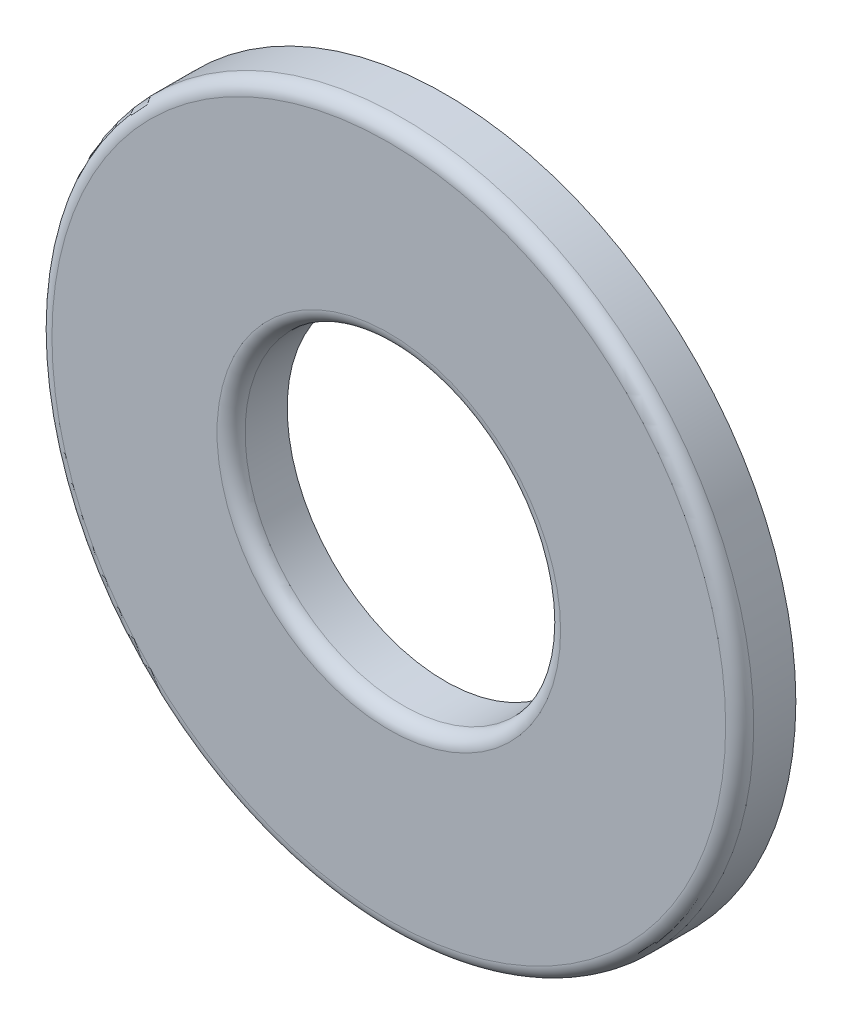
ISO-10303-21;
HEADER;
FILE_DESCRIPTION(('STEP AP214'),'2;1');
FILE_NAME('part.step','',(''),(''),'','','');
FILE_SCHEMA(('AUTOMOTIVE_DESIGN { 1 0 10303 214 1 1 1 1 }'));
ENDSEC;
DATA;
#1=APPLICATION_CONTEXT('core data for automotive mechanical design processes');
#2=APPLICATION_PROTOCOL_DEFINITION('international standard','automotive_design',2000,#1);
#3=PRODUCT_CONTEXT('',#1,'mechanical');
#4=PRODUCT('Part','Part','',(#3));
#5=PRODUCT_RELATED_PRODUCT_CATEGORY('part','',(#4));
#6=PRODUCT_DEFINITION_FORMATION('','',#4);
#7=PRODUCT_DEFINITION_CONTEXT('part definition',#1,'design');
#8=PRODUCT_DEFINITION('design','',#6,#7);
#9=PRODUCT_DEFINITION_SHAPE('','',#8);
#10=(LENGTH_UNIT() NAMED_UNIT(*) SI_UNIT(.MILLI.,.METRE.));
#11=(NAMED_UNIT(*) PLANE_ANGLE_UNIT() SI_UNIT($,.RADIAN.));
#12=(NAMED_UNIT(*) SI_UNIT($,.STERADIAN.) SOLID_ANGLE_UNIT());
#13=UNCERTAINTY_MEASURE_WITH_UNIT(LENGTH_MEASURE(1.E-05),#10,'distance_accuracy_value','');
#14=(GEOMETRIC_REPRESENTATION_CONTEXT(3) GLOBAL_UNCERTAINTY_ASSIGNED_CONTEXT((#13)) GLOBAL_UNIT_ASSIGNED_CONTEXT((#10,
#11,#12)) REPRESENTATION_CONTEXT('',''));
#15=CARTESIAN_POINT('',(0.,0.,0.));
#16=DIRECTION('',(0.,0.,1.));
#17=DIRECTION('',(1.,0.,0.));
#18=AXIS2_PLACEMENT_3D('',#15,#16,#17);
#19=CARTESIAN_POINT('',(0.,0.,0.634999999999997));
#20=DIRECTION('',(0.,0.,1.));
#21=DIRECTION('',(1.,0.,0.));
#22=AXIS2_PLACEMENT_3D('',#19,#20,#21);
#23=PLANE('',#22);
#24=CARTESIAN_POINT('',(0.,0.,0.634999999999997));
#25=DIRECTION('',(0.,0.,1.));
#26=DIRECTION('',(1.,0.,0.));
#27=AXIS2_PLACEMENT_3D('',#24,#25,#26);
#28=CIRCLE('',#27,7.62);
#29=CARTESIAN_POINT('',(7.62,0.,0.634999999999997));
#30=VERTEX_POINT('',#29);
#31=EDGE_CURVE('E56',#30,#30,#28,.T.);
#32=ORIENTED_EDGE('',*,*,#31,.T.);
#33=EDGE_LOOP('',(#32));
#34=FACE_BOUND('',#33,.T.);
#35=CARTESIAN_POINT('',(0.,0.,0.634999999999997));
#36=DIRECTION('',(0.,0.,1.));
#37=DIRECTION('',(1.,0.,0.));
#38=AXIS2_PLACEMENT_3D('',#35,#36,#37);
#39=CIRCLE('',#38,3.8862);
#40=CARTESIAN_POINT('',(3.8862,0.,0.634999999999997));
#41=VERTEX_POINT('',#40);
#42=EDGE_CURVE('E61',#41,#41,#39,.F.);
#43=ORIENTED_EDGE('',*,*,#42,.T.);
#44=EDGE_LOOP('',(#43));
#45=FACE_BOUND('',#44,.T.);
#46=ADVANCED_FACE('F43',(#34,#45),#23,.T.);
#47=CARTESIAN_POINT('',(0.,0.,0.634999999999997));
#48=DIRECTION('',(0.,0.,-1.));
#49=DIRECTION('',(-1.,0.,0.));
#50=AXIS2_PLACEMENT_3D('',#47,#48,#49);
#51=CYLINDRICAL_SURFACE('',#50,7.9375);
#52=CARTESIAN_POINT('',(0.,0.,0.317499999999997));
#53=DIRECTION('',(0.,0.,1.));
#54=DIRECTION('',(1.,0.,0.));
#55=AXIS2_PLACEMENT_3D('',#52,#53,#54);
#56=CIRCLE('',#55,7.9375);
#57=CARTESIAN_POINT('',(7.9375,0.,0.317499999999997));
#58=VERTEX_POINT('',#57);
#59=EDGE_CURVE('E51',#58,#58,#56,.F.);
#60=ORIENTED_EDGE('',*,*,#59,.T.);
#61=EDGE_LOOP('',(#60));
#62=FACE_BOUND('',#61,.T.);
#63=CARTESIAN_POINT('',(0.,0.,-0.635000000000003));
#64=DIRECTION('',(0.,0.,1.));
#65=DIRECTION('',(1.,0.,0.));
#66=AXIS2_PLACEMENT_3D('',#63,#64,#65);
#67=CIRCLE('',#66,7.9375);
#68=CARTESIAN_POINT('',(7.9375,0.,-0.635000000000003));
#69=VERTEX_POINT('',#68);
#70=EDGE_CURVE('E67',#69,#69,#67,.T.);
#71=ORIENTED_EDGE('',*,*,#70,.T.);
#72=EDGE_LOOP('',(#71));
#73=FACE_BOUND('',#72,.T.);
#74=ADVANCED_FACE('F81',(#62,#73),#51,.T.);
#75=CARTESIAN_POINT('',(0.,0.,0.634999999999997));
#76=DIRECTION('',(0.,0.,-1.));
#77=DIRECTION('',(-1.,0.,0.));
#78=AXIS2_PLACEMENT_3D('',#75,#76,#77);
#79=CYLINDRICAL_SURFACE('',#78,3.5687);
#80=CARTESIAN_POINT('',(0.,0.,0.317499999999997));
#81=DIRECTION('',(0.,0.,1.));
#82=DIRECTION('',(1.,0.,0.));
#83=AXIS2_PLACEMENT_3D('',#80,#81,#82);
#84=CIRCLE('',#83,3.5687);
#85=CARTESIAN_POINT('',(3.5687,0.,0.317499999999997));
#86=VERTEX_POINT('',#85);
#87=EDGE_CURVE('E10',#86,#86,#84,.T.);
#88=ORIENTED_EDGE('',*,*,#87,.T.);
#89=EDGE_LOOP('',(#88));
#90=FACE_BOUND('',#89,.T.);
#91=CARTESIAN_POINT('',(0.,0.,-0.635000000000003));
#92=DIRECTION('',(0.,0.,1.));
#93=DIRECTION('',(1.,0.,0.));
#94=AXIS2_PLACEMENT_3D('',#91,#92,#93);
#95=CIRCLE('',#94,3.5687);
#96=CARTESIAN_POINT('',(3.5687,0.,-0.635000000000003));
#97=VERTEX_POINT('',#96);
#98=EDGE_CURVE('E71',#97,#97,#95,.T.);
#99=ORIENTED_EDGE('',*,*,#98,.F.);
#100=EDGE_LOOP('',(#99));
#101=FACE_BOUND('',#100,.T.);
#102=ADVANCED_FACE('F79',(#90,#101),#79,.F.);
#103=CARTESIAN_POINT('',(0.,0.,-0.635000000000003));
#104=DIRECTION('',(0.,0.,1.));
#105=DIRECTION('',(1.,0.,0.));
#106=AXIS2_PLACEMENT_3D('',#103,#104,#105);
#107=PLANE('',#106);
#108=ORIENTED_EDGE('',*,*,#98,.T.);
#109=EDGE_LOOP('',(#108));
#110=FACE_BOUND('',#109,.T.);
#111=ORIENTED_EDGE('',*,*,#70,.F.);
#112=EDGE_LOOP('',(#111));
#113=FACE_BOUND('',#112,.T.);
#114=ADVANCED_FACE('F76',(#110,#113),#107,.F.);
#115=CARTESIAN_POINT('',(0.,0.,0.317499999999997));
#116=DIRECTION('',(0.,0.,1.));
#117=DIRECTION('',(1.,0.,0.));
#118=AXIS2_PLACEMENT_3D('',#115,#116,#117);
#119=TOROIDAL_SURFACE('',#118,7.62,0.3175);
#120=ORIENTED_EDGE('',*,*,#59,.F.);
#121=EDGE_LOOP('',(#120));
#122=FACE_BOUND('',#121,.T.);
#123=ORIENTED_EDGE('',*,*,#31,.F.);
#124=EDGE_LOOP('',(#123));
#125=FACE_BOUND('',#124,.T.);
#126=ADVANCED_FACE('F88',(#122,#125),#119,.T.);
#127=CARTESIAN_POINT('',(0.,0.,0.317499999999997));
#128=DIRECTION('',(0.,0.,1.));
#129=DIRECTION('',(1.,0.,0.));
#130=AXIS2_PLACEMENT_3D('',#127,#128,#129);
#131=TOROIDAL_SURFACE('',#130,3.8862,0.3175);
#132=ORIENTED_EDGE('',*,*,#42,.F.);
#133=EDGE_LOOP('',(#132));
#134=FACE_BOUND('',#133,.T.);
#135=ORIENTED_EDGE('',*,*,#87,.F.);
#136=EDGE_LOOP('',(#135));
#137=FACE_BOUND('',#136,.T.);
#138=ADVANCED_FACE('F45',(#134,#137),#131,.T.);
#139=CLOSED_SHELL('',(#46,#74,#102,#114,#126,#138));
#140=MANIFOLD_SOLID_BREP('B2',#139);
#141=ADVANCED_BREP_SHAPE_REPRESENTATION('',(#18,#140),#14);
#142=SHAPE_DEFINITION_REPRESENTATION(#9,#141);
ENDSEC;
END-ISO-10303-21;
